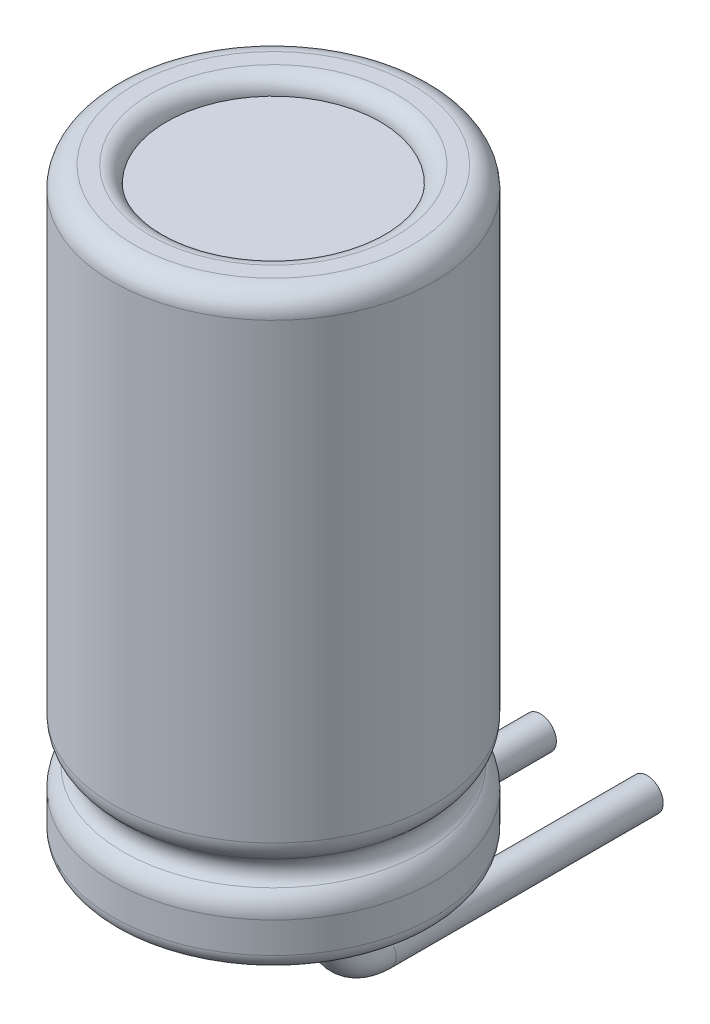
ISO-10303-21;
HEADER;
FILE_DESCRIPTION(('STEP AP214'),'2;1');
FILE_NAME('part.step','',(''),(''),'','','');
FILE_SCHEMA(('AUTOMOTIVE_DESIGN { 1 0 10303 214 1 1 1 1 }'));
ENDSEC;
DATA;
#1=APPLICATION_CONTEXT('core data for automotive mechanical design processes');
#2=APPLICATION_PROTOCOL_DEFINITION('international standard','automotive_design',2000,#1);
#3=PRODUCT_CONTEXT('',#1,'mechanical');
#4=PRODUCT('Part','Part','',(#3));
#5=PRODUCT_RELATED_PRODUCT_CATEGORY('part','',(#4));
#6=PRODUCT_DEFINITION_FORMATION('','',#4);
#7=PRODUCT_DEFINITION_CONTEXT('part definition',#1,'design');
#8=PRODUCT_DEFINITION('design','',#6,#7);
#9=PRODUCT_DEFINITION_SHAPE('','',#8);
#10=(LENGTH_UNIT() NAMED_UNIT(*) SI_UNIT(.MILLI.,.METRE.));
#11=(NAMED_UNIT(*) PLANE_ANGLE_UNIT() SI_UNIT($,.RADIAN.));
#12=(NAMED_UNIT(*) SI_UNIT($,.STERADIAN.) SOLID_ANGLE_UNIT());
#13=UNCERTAINTY_MEASURE_WITH_UNIT(LENGTH_MEASURE(1.E-05),#10,'distance_accuracy_value','');
#14=(GEOMETRIC_REPRESENTATION_CONTEXT(3) GLOBAL_UNCERTAINTY_ASSIGNED_CONTEXT((#13)) GLOBAL_UNIT_ASSIGNED_CONTEXT((#10,
#11,#12)) REPRESENTATION_CONTEXT('',''));
#15=CARTESIAN_POINT('',(0.,0.,0.));
#16=DIRECTION('',(0.,0.,1.));
#17=DIRECTION('',(1.,0.,0.));
#18=AXIS2_PLACEMENT_3D('',#15,#16,#17);
#19=CARTESIAN_POINT('',(1.,0.3,0.));
#20=DIRECTION('',(0.,-1.,0.));
#21=DIRECTION('',(0.,0.,-1.));
#22=AXIS2_PLACEMENT_3D('',#19,#20,#21);
#23=PLANE('',#22);
#24=CARTESIAN_POINT('',(1.,0.3,0.));
#25=DIRECTION('',(0.,1.,0.));
#26=DIRECTION('',(0.,0.,-1.));
#27=AXIS2_PLACEMENT_3D('',#24,#25,#26);
#28=CIRCLE('',#27,0.3);
#29=CARTESIAN_POINT('',(1.,0.3,-0.3));
#30=VERTEX_POINT('',#29);
#31=EDGE_CURVE('E58',#30,#30,#28,.T.);
#32=ORIENTED_EDGE('',*,*,#31,.T.);
#33=EDGE_LOOP('',(#32));
#34=FACE_BOUND('',#33,.T.);
#35=ADVANCED_FACE('F46',(#34),#23,.F.);
#36=CARTESIAN_POINT('',(1.,-1.7,-6.));
#37=DIRECTION('',(0.,0.,-1.));
#38=DIRECTION('',(0.,1.,0.));
#39=AXIS2_PLACEMENT_3D('',#36,#37,#38);
#40=PLANE('',#39);
#41=CARTESIAN_POINT('',(1.,-1.7,-6.));
#42=DIRECTION('',(0.,0.,1.));
#43=DIRECTION('',(0.,1.,0.));
#44=AXIS2_PLACEMENT_3D('',#41,#42,#43);
#45=CIRCLE('',#44,0.3);
#46=CARTESIAN_POINT('',(1.,-1.4,-6.));
#47=VERTEX_POINT('',#46);
#48=EDGE_CURVE('E12',#47,#47,#45,.T.);
#49=ORIENTED_EDGE('',*,*,#48,.F.);
#50=EDGE_LOOP('',(#49));
#51=FACE_BOUND('',#50,.T.);
#52=ADVANCED_FACE('F64',(#51),#40,.T.);
#53=CARTESIAN_POINT('',(1.,0.3,0.));
#54=DIRECTION('',(0.,-1.,0.));
#55=DIRECTION('',(0.,0.,-1.));
#56=AXIS2_PLACEMENT_3D('',#53,#54,#55);
#57=CYLINDRICAL_SURFACE('',#56,0.3);
#58=CARTESIAN_POINT('',(1.,-0.699999999999993,0.));
#59=DIRECTION('',(0.,1.,0.));
#60=DIRECTION('',(0.,0.,-1.));
#61=AXIS2_PLACEMENT_3D('',#58,#59,#60);
#62=CIRCLE('',#61,0.3);
#63=CARTESIAN_POINT('',(1.,-0.699999999999991,0.300000000000002));
#64=VERTEX_POINT('',#63);
#65=EDGE_CURVE('E86',#64,#64,#62,.T.);
#66=ORIENTED_EDGE('',*,*,#65,.T.);
#67=EDGE_LOOP('',(#66));
#68=FACE_BOUND('',#67,.T.);
#69=ORIENTED_EDGE('',*,*,#31,.F.);
#70=EDGE_LOOP('',(#69));
#71=FACE_BOUND('',#70,.T.);
#72=ADVANCED_FACE('F66',(#68,#71),#57,.T.);
#73=CARTESIAN_POINT('',(1.,-0.7,-1.));
#74=DIRECTION('',(-1.,0.,0.));
#75=DIRECTION('',(0.,0.,-1.));
#76=AXIS2_PLACEMENT_3D('',#73,#74,#75);
#77=TOROIDAL_SURFACE('',#76,1.,0.3);
#78=CARTESIAN_POINT('',(1.,-1.7,-1.00000000000001));
#79=DIRECTION('',(0.,0.,1.));
#80=DIRECTION('',(0.,1.,0.));
#81=AXIS2_PLACEMENT_3D('',#78,#79,#80);
#82=CIRCLE('',#81,0.3);
#83=CARTESIAN_POINT('',(1.,-2.,-1.00000000000001));
#84=VERTEX_POINT('',#83);
#85=EDGE_CURVE('E53',#84,#84,#82,.T.);
#86=CARTESIAN_POINT('',(1.,-0.7,-1.));
#87=DIRECTION('',(-1.,0.,0.));
#88=DIRECTION('',(0.,0.,-1.));
#89=AXIS2_PLACEMENT_3D('',#86,#87,#88);
#90=CIRCLE('',#89,1.3);
#91=EDGE_CURVE('',#84,#64,#90,.T.);
#92=ORIENTED_EDGE('',*,*,#85,.T.);
#93=ORIENTED_EDGE('',*,*,#65,.F.);
#94=ORIENTED_EDGE('',*,*,#91,.T.);
#95=ORIENTED_EDGE('',*,*,#91,.F.);
#96=EDGE_LOOP('',(#92,#94,#93,#95));
#97=FACE_BOUND('',#96,.T.);
#98=ADVANCED_FACE('F71',(#97),#77,.T.);
#99=CARTESIAN_POINT('',(1.,-1.7,-1.00000000000001));
#100=DIRECTION('',(0.,0.,-1.));
#101=DIRECTION('',(0.,1.,0.));
#102=AXIS2_PLACEMENT_3D('',#99,#100,#101);
#103=CYLINDRICAL_SURFACE('',#102,0.3);
#104=ORIENTED_EDGE('',*,*,#48,.T.);
#105=EDGE_LOOP('',(#104));
#106=FACE_BOUND('',#105,.T.);
#107=ORIENTED_EDGE('',*,*,#85,.F.);
#108=EDGE_LOOP('',(#107));
#109=FACE_BOUND('',#108,.T.);
#110=ADVANCED_FACE('F61',(#106,#109),#103,.T.);
#111=CLOSED_SHELL('',(#35,#52,#72,#98,#110));
#112=MANIFOLD_SOLID_BREP('B2',#111);
#113=CARTESIAN_POINT('',(-1.,0.3,0.));
#114=DIRECTION('',(0.,-1.,0.));
#115=DIRECTION('',(0.,0.,-1.));
#116=AXIS2_PLACEMENT_3D('',#113,#114,#115);
#117=PLANE('',#116);
#118=CARTESIAN_POINT('',(-1.,0.3,0.));
#119=DIRECTION('',(0.,-1.,0.));
#120=DIRECTION('',(0.,0.,-1.));
#121=AXIS2_PLACEMENT_3D('',#118,#119,#120);
#122=CIRCLE('',#121,0.3);
#123=CARTESIAN_POINT('',(-1.,0.3,-0.3));
#124=VERTEX_POINT('',#123);
#125=EDGE_CURVE('E148',#124,#124,#122,.T.);
#126=ORIENTED_EDGE('',*,*,#125,.F.);
#127=EDGE_LOOP('',(#126));
#128=FACE_BOUND('',#127,.T.);
#129=ADVANCED_FACE('F136',(#128),#117,.F.);
#130=CARTESIAN_POINT('',(-1.,-1.7,-6.));
#131=DIRECTION('',(0.,0.,-1.));
#132=DIRECTION('',(0.,1.,0.));
#133=AXIS2_PLACEMENT_3D('',#130,#131,#132);
#134=PLANE('',#133);
#135=CARTESIAN_POINT('',(-1.,-1.7,-6.));
#136=DIRECTION('',(0.,0.,-1.));
#137=DIRECTION('',(0.,1.,0.));
#138=AXIS2_PLACEMENT_3D('',#135,#136,#137);
#139=CIRCLE('',#138,0.3);
#140=CARTESIAN_POINT('',(-1.,-1.4,-6.));
#141=VERTEX_POINT('',#140);
#142=EDGE_CURVE('E44',#141,#141,#139,.T.);
#143=ORIENTED_EDGE('',*,*,#142,.T.);
#144=EDGE_LOOP('',(#143));
#145=FACE_BOUND('',#144,.T.);
#146=ADVANCED_FACE('F151',(#145),#134,.T.);
#147=CARTESIAN_POINT('',(-1.,0.3,0.));
#148=DIRECTION('',(0.,-1.,0.));
#149=DIRECTION('',(0.,0.,-1.));
#150=AXIS2_PLACEMENT_3D('',#147,#148,#149);
#151=CYLINDRICAL_SURFACE('',#150,0.3);
#152=CARTESIAN_POINT('',(-1.,-0.699999999999993,0.));
#153=DIRECTION('',(0.,-1.,0.));
#154=DIRECTION('',(0.,0.,-1.));
#155=AXIS2_PLACEMENT_3D('',#152,#153,#154);
#156=CIRCLE('',#155,0.3);
#157=CARTESIAN_POINT('',(-1.,-0.699999999999991,0.300000000000002));
#158=VERTEX_POINT('',#157);
#159=EDGE_CURVE('E161',#158,#158,#156,.T.);
#160=ORIENTED_EDGE('',*,*,#159,.F.);
#161=EDGE_LOOP('',(#160));
#162=FACE_BOUND('',#161,.T.);
#163=ORIENTED_EDGE('',*,*,#125,.T.);
#164=EDGE_LOOP('',(#163));
#165=FACE_BOUND('',#164,.T.);
#166=ADVANCED_FACE('F166',(#162,#165),#151,.T.);
#167=CARTESIAN_POINT('',(-1.,-0.7,-1.));
#168=DIRECTION('',(1.,0.,0.));
#169=DIRECTION('',(0.,0.,-1.));
#170=AXIS2_PLACEMENT_3D('',#167,#168,#169);
#171=TOROIDAL_SURFACE('',#170,1.,0.3);
#172=CARTESIAN_POINT('',(-1.,-1.7,-1.00000000000001));
#173=DIRECTION('',(0.,0.,-1.));
#174=DIRECTION('',(0.,1.,0.));
#175=AXIS2_PLACEMENT_3D('',#172,#173,#174);
#176=CIRCLE('',#175,0.3);
#177=CARTESIAN_POINT('',(-1.,-2.,-1.00000000000001));
#178=VERTEX_POINT('',#177);
#179=EDGE_CURVE('E143',#178,#178,#176,.T.);
#180=CARTESIAN_POINT('',(-1.,-0.7,-1.));
#181=DIRECTION('',(1.,0.,0.));
#182=DIRECTION('',(0.,0.,-1.));
#183=AXIS2_PLACEMENT_3D('',#180,#181,#182);
#184=CIRCLE('',#183,1.3);
#185=EDGE_CURVE('',#158,#178,#184,.T.);
#186=ORIENTED_EDGE('',*,*,#159,.T.);
#187=ORIENTED_EDGE('',*,*,#179,.F.);
#188=ORIENTED_EDGE('',*,*,#185,.T.);
#189=ORIENTED_EDGE('',*,*,#185,.F.);
#190=EDGE_LOOP('',(#186,#188,#187,#189));
#191=FACE_BOUND('',#190,.T.);
#192=ADVANCED_FACE('F156',(#191),#171,.T.);
#193=CARTESIAN_POINT('',(-1.,-1.7,-1.00000000000001));
#194=DIRECTION('',(0.,0.,-1.));
#195=DIRECTION('',(0.,1.,0.));
#196=AXIS2_PLACEMENT_3D('',#193,#194,#195);
#197=CYLINDRICAL_SURFACE('',#196,0.3);
#198=ORIENTED_EDGE('',*,*,#142,.F.);
#199=EDGE_LOOP('',(#198));
#200=FACE_BOUND('',#199,.T.);
#201=ORIENTED_EDGE('',*,*,#179,.T.);
#202=EDGE_LOOP('',(#201));
#203=FACE_BOUND('',#202,.T.);
#204=ADVANCED_FACE('F153',(#200,#203),#197,.T.);
#205=CLOSED_SHELL('',(#129,#146,#166,#192,#204));
#206=MANIFOLD_SOLID_BREP('B6',#205);
#207=CARTESIAN_POINT('',(0.,11.,0.));
#208=DIRECTION('',(0.,-1.,0.));
#209=DIRECTION('',(0.,0.,-1.));
#210=AXIS2_PLACEMENT_3D('',#207,#208,#209);
#211=CYLINDRICAL_SURFACE('',#210,3.);
#212=CARTESIAN_POINT('',(0.,0.3,0.));
#213=DIRECTION('',(0.,1.,0.));
#214=DIRECTION('',(0.,0.,1.));
#215=AXIS2_PLACEMENT_3D('',#212,#213,#214);
#216=CIRCLE('',#215,3.);
#217=CARTESIAN_POINT('',(0.,0.3,3.));
#218=VERTEX_POINT('',#217);
#219=EDGE_CURVE('E216',#218,#218,#216,.T.);
#220=ORIENTED_EDGE('',*,*,#219,.T.);
#221=EDGE_LOOP('',(#220));
#222=FACE_BOUND('',#221,.T.);
#223=CARTESIAN_POINT('',(0.,0.875500200160161,0.));
#224=DIRECTION('',(0.,1.,0.));
#225=DIRECTION('',(0.,0.,1.));
#226=AXIS2_PLACEMENT_3D('',#223,#224,#225);
#227=CIRCLE('',#226,3.);
#228=CARTESIAN_POINT('',(0.,0.875500200160161,3.));
#229=VERTEX_POINT('',#228);
#230=EDGE_CURVE('E244',#229,#229,#227,.F.);
#231=ORIENTED_EDGE('',*,*,#230,.T.);
#232=EDGE_LOOP('',(#231));
#233=FACE_BOUND('',#232,.T.);
#234=ADVANCED_FACE('F209',(#222,#233),#211,.T.);
#235=CARTESIAN_POINT('',(0.,0.,0.));
#236=DIRECTION('',(0.,1.,0.));
#237=DIRECTION('',(0.,0.,1.));
#238=AXIS2_PLACEMENT_3D('',#235,#236,#237);
#239=PLANE('',#238);
#240=CARTESIAN_POINT('',(0.,0.,0.));
#241=DIRECTION('',(0.,1.,0.));
#242=DIRECTION('',(0.,0.,1.));
#243=AXIS2_PLACEMENT_3D('',#240,#241,#242);
#244=CIRCLE('',#243,2.7);
#245=CARTESIAN_POINT('',(0.,0.,2.7));
#246=VERTEX_POINT('',#245);
#247=EDGE_CURVE('E135',#246,#246,#244,.F.);
#248=ORIENTED_EDGE('',*,*,#247,.T.);
#249=EDGE_LOOP('',(#248));
#250=FACE_BOUND('',#249,.T.);
#251=CARTESIAN_POINT('',(0.,0.,0.));
#252=DIRECTION('',(0.,1.,0.));
#253=DIRECTION('',(0.,0.,1.));
#254=AXIS2_PLACEMENT_3D('',#251,#252,#253);
#255=CIRCLE('',#254,2.3);
#256=CARTESIAN_POINT('',(0.,0.,2.3));
#257=VERTEX_POINT('',#256);
#258=EDGE_CURVE('E220',#257,#257,#255,.T.);
#259=ORIENTED_EDGE('',*,*,#258,.T.);
#260=EDGE_LOOP('',(#259));
#261=FACE_BOUND('',#260,.T.);
#262=ADVANCED_FACE('F272',(#250,#261),#239,.F.);
#263=CARTESIAN_POINT('',(0.,0.3,0.));
#264=DIRECTION('',(0.,-1.,0.));
#265=DIRECTION('',(0.,0.,-1.));
#266=AXIS2_PLACEMENT_3D('',#263,#264,#265);
#267=PLANE('',#266);
#268=CARTESIAN_POINT('',(0.,0.3,0.));
#269=DIRECTION('',(0.,-1.,0.));
#270=DIRECTION('',(0.,0.,-1.));
#271=AXIS2_PLACEMENT_3D('',#268,#269,#270);
#272=CIRCLE('',#271,2.);
#273=CARTESIAN_POINT('',(0.,0.3,-2.));
#274=VERTEX_POINT('',#273);
#275=EDGE_CURVE('E247',#274,#274,#272,.T.);
#276=ORIENTED_EDGE('',*,*,#275,.T.);
#277=EDGE_LOOP('',(#276));
#278=FACE_BOUND('',#277,.T.);
#279=ADVANCED_FACE('F278',(#278),#267,.T.);
#280=CARTESIAN_POINT('',(0.,1.5,0.));
#281=DIRECTION('',(0.,-1.,0.));
#282=DIRECTION('',(0.,0.,-1.));
#283=AXIS2_PLACEMENT_3D('',#280,#281,#282);
#284=TOROIDAL_SURFACE('',#283,3.,0.3);
#285=CARTESIAN_POINT('',(0.,1.26581257506006,0.));
#286=DIRECTION('',(0.,1.,0.));
#287=DIRECTION('',(0.,0.,1.));
#288=AXIS2_PLACEMENT_3D('',#285,#286,#287);
#289=CIRCLE('',#288,2.8125);
#290=CARTESIAN_POINT('',(0.,1.26581257506006,2.8125));
#291=VERTEX_POINT('',#290);
#292=EDGE_CURVE('E238',#291,#291,#289,.T.);
#293=ORIENTED_EDGE('',*,*,#292,.T.);
#294=EDGE_LOOP('',(#293));
#295=FACE_BOUND('',#294,.T.);
#296=CARTESIAN_POINT('',(0.,1.73418742493993,0.));
#297=DIRECTION('',(0.,-1.,0.));
#298=DIRECTION('',(0.,0.,-1.));
#299=AXIS2_PLACEMENT_3D('',#296,#297,#298);
#300=CIRCLE('',#299,2.81250000000001);
#301=CARTESIAN_POINT('',(0.,1.73418742493993,-2.81250000000001));
#302=VERTEX_POINT('',#301);
#303=EDGE_CURVE('E241',#302,#302,#300,.T.);
#304=ORIENTED_EDGE('',*,*,#303,.T.);
#305=EDGE_LOOP('',(#304));
#306=FACE_BOUND('',#305,.T.);
#307=ADVANCED_FACE('F302',(#295,#306),#284,.F.);
#308=CARTESIAN_POINT('',(0.,10.7,0.));
#309=DIRECTION('',(0.,1.,0.));
#310=DIRECTION('',(0.,0.,1.));
#311=AXIS2_PLACEMENT_3D('',#308,#309,#310);
#312=PLANE('',#311);
#313=CARTESIAN_POINT('',(0.,10.7,0.));
#314=DIRECTION('',(0.,1.,0.));
#315=DIRECTION('',(0.,0.,1.));
#316=AXIS2_PLACEMENT_3D('',#313,#314,#315);
#317=CIRCLE('',#316,2.);
#318=CARTESIAN_POINT('',(0.,10.7,2.));
#319=VERTEX_POINT('',#318);
#320=EDGE_CURVE('E250',#319,#319,#317,.T.);
#321=ORIENTED_EDGE('',*,*,#320,.T.);
#322=EDGE_LOOP('',(#321));
#323=FACE_BOUND('',#322,.T.);
#324=ADVANCED_FACE('F254',(#323),#312,.T.);
#325=CARTESIAN_POINT('',(0.,11.,0.));
#326=DIRECTION('',(0.,1.,0.));
#327=DIRECTION('',(0.,0.,1.));
#328=AXIS2_PLACEMENT_3D('',#325,#326,#327);
#329=PLANE('',#328);
#330=CARTESIAN_POINT('',(0.,11.,0.));
#331=DIRECTION('',(0.,1.,0.));
#332=DIRECTION('',(0.,0.,1.));
#333=AXIS2_PLACEMENT_3D('',#330,#331,#332);
#334=CIRCLE('',#333,2.3);
#335=CARTESIAN_POINT('',(0.,11.,2.3));
#336=VERTEX_POINT('',#335);
#337=EDGE_CURVE('E224',#336,#336,#334,.F.);
#338=ORIENTED_EDGE('',*,*,#337,.T.);
#339=EDGE_LOOP('',(#338));
#340=FACE_BOUND('',#339,.T.);
#341=CARTESIAN_POINT('',(0.,11.,0.));
#342=DIRECTION('',(0.,1.,0.));
#343=DIRECTION('',(0.,0.,1.));
#344=AXIS2_PLACEMENT_3D('',#341,#342,#343);
#345=CIRCLE('',#344,2.6);
#346=CARTESIAN_POINT('',(0.,11.,2.6));
#347=VERTEX_POINT('',#346);
#348=EDGE_CURVE('E232',#347,#347,#345,.T.);
#349=ORIENTED_EDGE('',*,*,#348,.T.);
#350=EDGE_LOOP('',(#349));
#351=FACE_BOUND('',#350,.T.);
#352=ADVANCED_FACE('F284',(#340,#351),#329,.T.);
#353=CARTESIAN_POINT('',(0.,10.6,0.));
#354=DIRECTION('',(0.,1.,0.));
#355=DIRECTION('',(0.,0.,1.));
#356=AXIS2_PLACEMENT_3D('',#353,#354,#355);
#357=CIRCLE('',#356,3.);
#358=CARTESIAN_POINT('',(0.,10.6,3.));
#359=VERTEX_POINT('',#358);
#360=EDGE_CURVE('E229',#359,#359,#357,.F.);
#361=ORIENTED_EDGE('',*,*,#360,.T.);
#362=EDGE_LOOP('',(#361));
#363=FACE_BOUND('',#362,.T.);
#364=CARTESIAN_POINT('',(0.,2.12449979983984,0.));
#365=DIRECTION('',(0.,1.,0.));
#366=DIRECTION('',(0.,0.,1.));
#367=AXIS2_PLACEMENT_3D('',#364,#365,#366);
#368=CIRCLE('',#367,3.);
#369=CARTESIAN_POINT('',(0.,2.12449979983984,3.));
#370=VERTEX_POINT('',#369);
#371=EDGE_CURVE('E235',#370,#370,#368,.T.);
#372=ORIENTED_EDGE('',*,*,#371,.T.);
#373=EDGE_LOOP('',(#372));
#374=FACE_BOUND('',#373,.T.);
#375=ADVANCED_FACE('F274',(#363,#374),#211,.T.);
#376=CARTESIAN_POINT('',(0.,0.875500200160161,0.));
#377=DIRECTION('',(0.,1.,0.));
#378=DIRECTION('',(0.,0.,1.));
#379=AXIS2_PLACEMENT_3D('',#376,#377,#378);
#380=TOROIDAL_SURFACE('',#379,2.5,0.5);
#381=ORIENTED_EDGE('',*,*,#292,.F.);
#382=EDGE_LOOP('',(#381));
#383=FACE_BOUND('',#382,.T.);
#384=ORIENTED_EDGE('',*,*,#230,.F.);
#385=EDGE_LOOP('',(#384));
#386=FACE_BOUND('',#385,.T.);
#387=ADVANCED_FACE('F283',(#383,#386),#380,.T.);
#388=CARTESIAN_POINT('',(0.,2.12449979983984,0.));
#389=DIRECTION('',(0.,1.,0.));
#390=DIRECTION('',(0.,0.,1.));
#391=AXIS2_PLACEMENT_3D('',#388,#389,#390);
#392=TOROIDAL_SURFACE('',#391,2.5,0.5);
#393=ORIENTED_EDGE('',*,*,#371,.F.);
#394=EDGE_LOOP('',(#393));
#395=FACE_BOUND('',#394,.T.);
#396=ORIENTED_EDGE('',*,*,#303,.F.);
#397=EDGE_LOOP('',(#396));
#398=FACE_BOUND('',#397,.T.);
#399=ADVANCED_FACE('F267',(#395,#398),#392,.T.);
#400=CARTESIAN_POINT('',(0.,10.6,0.));
#401=DIRECTION('',(0.,1.,0.));
#402=DIRECTION('',(0.,0.,1.));
#403=AXIS2_PLACEMENT_3D('',#400,#401,#402);
#404=TOROIDAL_SURFACE('',#403,2.6,0.4);
#405=ORIENTED_EDGE('',*,*,#360,.F.);
#406=EDGE_LOOP('',(#405));
#407=FACE_BOUND('',#406,.T.);
#408=ORIENTED_EDGE('',*,*,#348,.F.);
#409=EDGE_LOOP('',(#408));
#410=FACE_BOUND('',#409,.T.);
#411=ADVANCED_FACE('F259',(#407,#410),#404,.T.);
#412=CARTESIAN_POINT('',(0.,10.7,0.));
#413=DIRECTION('',(0.,1.,0.));
#414=DIRECTION('',(0.,0.,1.));
#415=AXIS2_PLACEMENT_3D('',#412,#413,#414);
#416=TOROIDAL_SURFACE('',#415,2.3,0.3);
#417=ORIENTED_EDGE('',*,*,#337,.F.);
#418=EDGE_LOOP('',(#417));
#419=FACE_BOUND('',#418,.T.);
#420=ORIENTED_EDGE('',*,*,#320,.F.);
#421=EDGE_LOOP('',(#420));
#422=FACE_BOUND('',#421,.T.);
#423=ADVANCED_FACE('F256',(#419,#422),#416,.T.);
#424=CARTESIAN_POINT('',(0.,0.3,0.));
#425=DIRECTION('',(0.,1.,0.));
#426=DIRECTION('',(0.,0.,1.));
#427=AXIS2_PLACEMENT_3D('',#424,#425,#426);
#428=TOROIDAL_SURFACE('',#427,2.3,0.3);
#429=ORIENTED_EDGE('',*,*,#258,.F.);
#430=EDGE_LOOP('',(#429));
#431=FACE_BOUND('',#430,.T.);
#432=ORIENTED_EDGE('',*,*,#275,.F.);
#433=EDGE_LOOP('',(#432));
#434=FACE_BOUND('',#433,.T.);
#435=ADVANCED_FACE('F258',(#431,#434),#428,.T.);
#436=CARTESIAN_POINT('',(0.,0.3,0.));
#437=DIRECTION('',(0.,1.,0.));
#438=DIRECTION('',(0.,0.,1.));
#439=AXIS2_PLACEMENT_3D('',#436,#437,#438);
#440=TOROIDAL_SURFACE('',#439,2.7,0.3);
#441=ORIENTED_EDGE('',*,*,#247,.F.);
#442=EDGE_LOOP('',(#441));
#443=FACE_BOUND('',#442,.T.);
#444=ORIENTED_EDGE('',*,*,#219,.F.);
#445=EDGE_LOOP('',(#444));
#446=FACE_BOUND('',#445,.T.);
#447=ADVANCED_FACE('F211',(#443,#446),#440,.T.);
#448=CLOSED_SHELL('',(#234,#262,#279,#307,#324,#352,#375,#387,#399,#411,#423,#435,#447));
#449=MANIFOLD_SOLID_BREP('B38',#448);
#450=ADVANCED_BREP_SHAPE_REPRESENTATION('',(#18,#112,#206,#449),#14);
#451=SHAPE_DEFINITION_REPRESENTATION(#9,#450);
ENDSEC;
END-ISO-10303-21;
